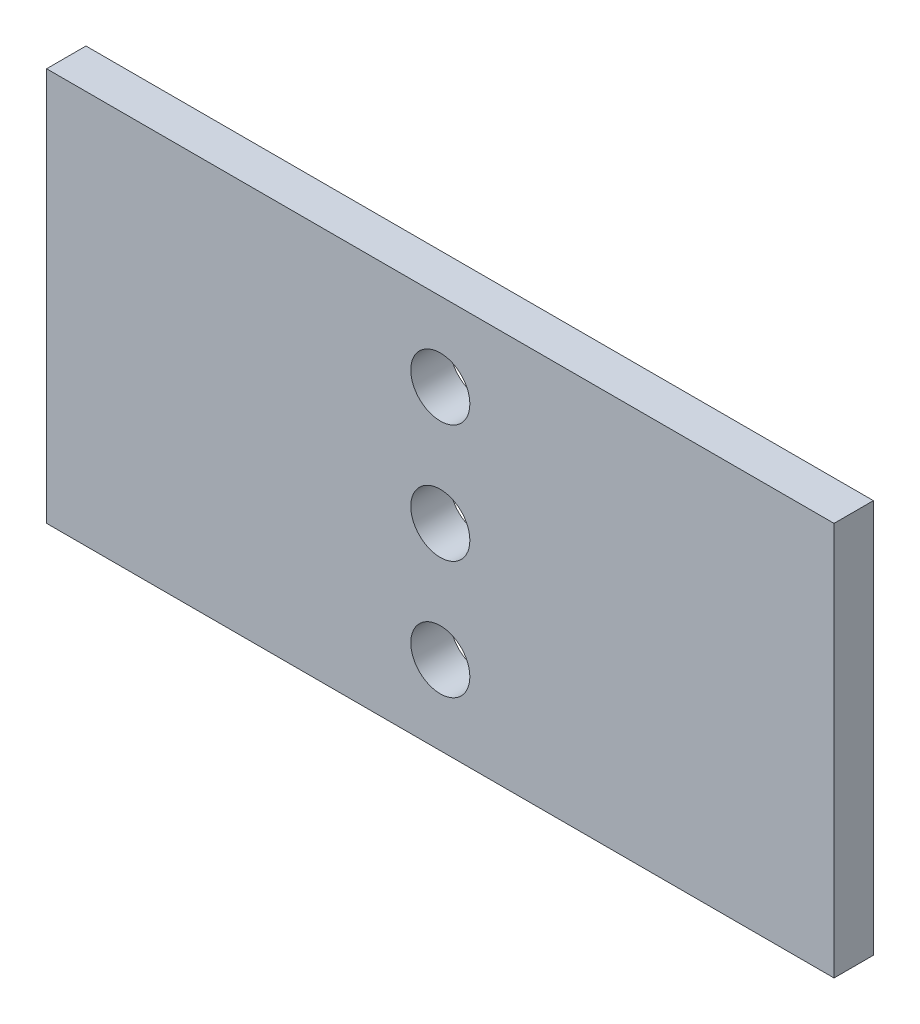
ISO-10303-21;
HEADER;
FILE_DESCRIPTION(('STEP AP214'),'2;1');
FILE_NAME('part.step','',(''),(''),'','','');
FILE_SCHEMA(('AUTOMOTIVE_DESIGN { 1 0 10303 214 1 1 1 1 }'));
ENDSEC;
DATA;
#1=APPLICATION_CONTEXT('core data for automotive mechanical design processes');
#2=APPLICATION_PROTOCOL_DEFINITION('international standard','automotive_design',2000,#1);
#3=PRODUCT_CONTEXT('',#1,'mechanical');
#4=PRODUCT('Part','Part','',(#3));
#5=PRODUCT_RELATED_PRODUCT_CATEGORY('part','',(#4));
#6=PRODUCT_DEFINITION_FORMATION('','',#4);
#7=PRODUCT_DEFINITION_CONTEXT('part definition',#1,'design');
#8=PRODUCT_DEFINITION('design','',#6,#7);
#9=PRODUCT_DEFINITION_SHAPE('','',#8);
#10=(LENGTH_UNIT() NAMED_UNIT(*) SI_UNIT(.MILLI.,.METRE.));
#11=(NAMED_UNIT(*) PLANE_ANGLE_UNIT() SI_UNIT($,.RADIAN.));
#12=(NAMED_UNIT(*) SI_UNIT($,.STERADIAN.) SOLID_ANGLE_UNIT());
#13=UNCERTAINTY_MEASURE_WITH_UNIT(LENGTH_MEASURE(1.E-05),#10,'distance_accuracy_value','');
#14=(GEOMETRIC_REPRESENTATION_CONTEXT(3) GLOBAL_UNCERTAINTY_ASSIGNED_CONTEXT((#13)) GLOBAL_UNIT_ASSIGNED_CONTEXT((#10,
#11,#12)) REPRESENTATION_CONTEXT('',''));
#15=CARTESIAN_POINT('',(0.,0.,0.));
#16=DIRECTION('',(0.,0.,1.));
#17=DIRECTION('',(1.,0.,0.));
#18=AXIS2_PLACEMENT_3D('',#15,#16,#17);
#19=CARTESIAN_POINT('',(0.,0.,10.));
#20=DIRECTION('',(0.,0.,-1.));
#21=DIRECTION('',(-1.,0.,0.));
#22=AXIS2_PLACEMENT_3D('',#19,#20,#21);
#23=PLANE('',#22);
#24=DIRECTION('',(0.,1.,0.));
#25=VECTOR('',#24,1.);
#26=CARTESIAN_POINT('',(99.9999999999999,-50.,10.));
#27=LINE('',#26,#25);
#28=CARTESIAN_POINT('',(99.9999999999999,-50.,10.));
#29=VERTEX_POINT('',#28);
#30=CARTESIAN_POINT('',(99.9999999999999,50.,10.));
#31=VERTEX_POINT('',#30);
#32=EDGE_CURVE('E95',#29,#31,#27,.T.);
#33=ORIENTED_EDGE('',*,*,#32,.T.);
#34=DIRECTION('',(-1.,0.,0.));
#35=VECTOR('',#34,1.);
#36=CARTESIAN_POINT('',(-100.,50.,10.));
#37=LINE('',#36,#35);
#38=CARTESIAN_POINT('',(-100.,50.,10.));
#39=VERTEX_POINT('',#38);
#40=EDGE_CURVE('E90',#31,#39,#37,.T.);
#41=ORIENTED_EDGE('',*,*,#40,.T.);
#42=DIRECTION('',(0.,-1.,0.));
#43=VECTOR('',#42,1.);
#44=CARTESIAN_POINT('',(-100.,-50.,10.));
#45=LINE('',#44,#43);
#46=CARTESIAN_POINT('',(-100.,-50.,10.));
#47=VERTEX_POINT('',#46);
#48=EDGE_CURVE('E93',#39,#47,#45,.T.);
#49=ORIENTED_EDGE('',*,*,#48,.T.);
#50=DIRECTION('',(1.,0.,0.));
#51=VECTOR('',#50,1.);
#52=CARTESIAN_POINT('',(-100.,-50.,10.));
#53=LINE('',#52,#51);
#54=EDGE_CURVE('E60',#47,#29,#53,.T.);
#55=ORIENTED_EDGE('',*,*,#54,.T.);
#56=EDGE_LOOP('',(#33,#41,#49,#55));
#57=FACE_BOUND('',#56,.T.);
#58=CARTESIAN_POINT('',(0.,0.,10.));
#59=DIRECTION('',(0.,0.,1.));
#60=DIRECTION('',(1.,0.,0.));
#61=AXIS2_PLACEMENT_3D('',#58,#59,#60);
#62=CIRCLE('',#61,7.5);
#63=CARTESIAN_POINT('',(7.5,0.,10.));
#64=VERTEX_POINT('',#63);
#65=EDGE_CURVE('E111',#64,#64,#62,.T.);
#66=ORIENTED_EDGE('',*,*,#65,.F.);
#67=EDGE_LOOP('',(#66));
#68=FACE_BOUND('',#67,.T.);
#69=CARTESIAN_POINT('',(0.,30.,10.));
#70=DIRECTION('',(0.,0.,1.));
#71=DIRECTION('',(1.,0.,0.));
#72=AXIS2_PLACEMENT_3D('',#69,#70,#71);
#73=CIRCLE('',#72,7.5);
#74=CARTESIAN_POINT('',(7.5,30.,10.));
#75=VERTEX_POINT('',#74);
#76=EDGE_CURVE('E126',#75,#75,#73,.T.);
#77=ORIENTED_EDGE('',*,*,#76,.F.);
#78=EDGE_LOOP('',(#77));
#79=FACE_BOUND('',#78,.T.);
#80=CARTESIAN_POINT('',(0.,-30.,10.));
#81=DIRECTION('',(0.,0.,1.));
#82=DIRECTION('',(1.,0.,0.));
#83=AXIS2_PLACEMENT_3D('',#80,#81,#82);
#84=CIRCLE('',#83,7.5);
#85=CARTESIAN_POINT('',(7.5,-30.,10.));
#86=VERTEX_POINT('',#85);
#87=EDGE_CURVE('E132',#86,#86,#84,.T.);
#88=ORIENTED_EDGE('',*,*,#87,.F.);
#89=EDGE_LOOP('',(#88));
#90=FACE_BOUND('',#89,.T.);
#91=ADVANCED_FACE('F43',(#57,#68,#79,#90),#23,.F.);
#92=CARTESIAN_POINT('',(0.,0.,0.));
#93=DIRECTION('',(0.,0.,-1.));
#94=DIRECTION('',(-1.,0.,0.));
#95=AXIS2_PLACEMENT_3D('',#92,#93,#94);
#96=PLANE('',#95);
#97=CARTESIAN_POINT('',(0.,30.,0.));
#98=DIRECTION('',(0.,0.,1.));
#99=DIRECTION('',(1.,0.,0.));
#100=AXIS2_PLACEMENT_3D('',#97,#98,#99);
#101=CIRCLE('',#100,7.5);
#102=CARTESIAN_POINT('',(7.5,30.,0.));
#103=VERTEX_POINT('',#102);
#104=EDGE_CURVE('E129',#103,#103,#101,.T.);
#105=ORIENTED_EDGE('',*,*,#104,.T.);
#106=EDGE_LOOP('',(#105));
#107=FACE_BOUND('',#106,.T.);
#108=DIRECTION('',(0.,1.,0.));
#109=VECTOR('',#108,1.);
#110=CARTESIAN_POINT('',(99.9999999999999,-50.,0.));
#111=LINE('',#110,#109);
#112=CARTESIAN_POINT('',(99.9999999999999,-50.,0.));
#113=VERTEX_POINT('',#112);
#114=CARTESIAN_POINT('',(99.9999999999999,50.,0.));
#115=VERTEX_POINT('',#114);
#116=EDGE_CURVE('E108',#113,#115,#111,.T.);
#117=ORIENTED_EDGE('',*,*,#116,.F.);
#118=DIRECTION('',(1.,0.,0.));
#119=VECTOR('',#118,1.);
#120=CARTESIAN_POINT('',(-100.,-50.,0.));
#121=LINE('',#120,#119);
#122=CARTESIAN_POINT('',(-100.,-50.,0.));
#123=VERTEX_POINT('',#122);
#124=EDGE_CURVE('E83',#123,#113,#121,.T.);
#125=ORIENTED_EDGE('',*,*,#124,.F.);
#126=DIRECTION('',(0.,-1.,0.));
#127=VECTOR('',#126,1.);
#128=CARTESIAN_POINT('',(-100.,-50.,0.));
#129=LINE('',#128,#127);
#130=CARTESIAN_POINT('',(-100.,50.,0.));
#131=VERTEX_POINT('',#130);
#132=EDGE_CURVE('E77',#131,#123,#129,.T.);
#133=ORIENTED_EDGE('',*,*,#132,.F.);
#134=DIRECTION('',(-1.,0.,0.));
#135=VECTOR('',#134,1.);
#136=CARTESIAN_POINT('',(-100.,50.,0.));
#137=LINE('',#136,#135);
#138=EDGE_CURVE('E99',#115,#131,#137,.T.);
#139=ORIENTED_EDGE('',*,*,#138,.F.);
#140=EDGE_LOOP('',(#117,#125,#133,#139));
#141=FACE_BOUND('',#140,.T.);
#142=CARTESIAN_POINT('',(0.,0.,0.));
#143=DIRECTION('',(0.,0.,1.));
#144=DIRECTION('',(1.,0.,0.));
#145=AXIS2_PLACEMENT_3D('',#142,#143,#144);
#146=CIRCLE('',#145,7.5);
#147=CARTESIAN_POINT('',(7.5,0.,0.));
#148=VERTEX_POINT('',#147);
#149=EDGE_CURVE('E123',#148,#148,#146,.T.);
#150=ORIENTED_EDGE('',*,*,#149,.T.);
#151=EDGE_LOOP('',(#150));
#152=FACE_BOUND('',#151,.T.);
#153=CARTESIAN_POINT('',(0.,-30.,0.));
#154=DIRECTION('',(0.,0.,1.));
#155=DIRECTION('',(1.,0.,0.));
#156=AXIS2_PLACEMENT_3D('',#153,#154,#155);
#157=CIRCLE('',#156,7.5);
#158=CARTESIAN_POINT('',(7.5,-30.,0.));
#159=VERTEX_POINT('',#158);
#160=EDGE_CURVE('E135',#159,#159,#157,.T.);
#161=ORIENTED_EDGE('',*,*,#160,.T.);
#162=EDGE_LOOP('',(#161));
#163=FACE_BOUND('',#162,.T.);
#164=ADVANCED_FACE('F119',(#107,#141,#152,#163),#96,.T.);
#165=CARTESIAN_POINT('',(99.9999999999999,-50.,10.));
#166=DIRECTION('',(-1.,0.,0.));
#167=DIRECTION('',(0.,0.,1.));
#168=AXIS2_PLACEMENT_3D('',#165,#166,#167);
#169=PLANE('',#168);
#170=ORIENTED_EDGE('',*,*,#116,.T.);
#171=DIRECTION('',(0.,0.,-1.));
#172=VECTOR('',#171,1.);
#173=CARTESIAN_POINT('',(99.9999999999999,50.,10.));
#174=LINE('',#173,#172);
#175=EDGE_CURVE('E12',#31,#115,#174,.T.);
#176=ORIENTED_EDGE('',*,*,#175,.F.);
#177=ORIENTED_EDGE('',*,*,#32,.F.);
#178=DIRECTION('',(0.,0.,-1.));
#179=VECTOR('',#178,1.);
#180=CARTESIAN_POINT('',(99.9999999999999,-50.,10.));
#181=LINE('',#180,#179);
#182=EDGE_CURVE('E103',#29,#113,#181,.T.);
#183=ORIENTED_EDGE('',*,*,#182,.T.);
#184=EDGE_LOOP('',(#170,#176,#177,#183));
#185=FACE_BOUND('',#184,.T.);
#186=ADVANCED_FACE('F45',(#185),#169,.F.);
#187=CARTESIAN_POINT('',(-100.,50.,10.));
#188=DIRECTION('',(0.,-1.,0.));
#189=DIRECTION('',(0.,0.,-1.));
#190=AXIS2_PLACEMENT_3D('',#187,#188,#189);
#191=PLANE('',#190);
#192=ORIENTED_EDGE('',*,*,#138,.T.);
#193=DIRECTION('',(0.,0.,-1.));
#194=VECTOR('',#193,1.);
#195=CARTESIAN_POINT('',(-100.,50.,10.));
#196=LINE('',#195,#194);
#197=EDGE_CURVE('E52',#39,#131,#196,.T.);
#198=ORIENTED_EDGE('',*,*,#197,.F.);
#199=ORIENTED_EDGE('',*,*,#40,.F.);
#200=ORIENTED_EDGE('',*,*,#175,.T.);
#201=EDGE_LOOP('',(#192,#198,#199,#200));
#202=FACE_BOUND('',#201,.T.);
#203=ADVANCED_FACE('F98',(#202),#191,.F.);
#204=CARTESIAN_POINT('',(-100.,-50.,10.));
#205=DIRECTION('',(1.,0.,0.));
#206=DIRECTION('',(0.,0.,-1.));
#207=AXIS2_PLACEMENT_3D('',#204,#205,#206);
#208=PLANE('',#207);
#209=ORIENTED_EDGE('',*,*,#132,.T.);
#210=DIRECTION('',(0.,0.,-1.));
#211=VECTOR('',#210,1.);
#212=CARTESIAN_POINT('',(-100.,-50.,10.));
#213=LINE('',#212,#211);
#214=EDGE_CURVE('E100',#47,#123,#213,.T.);
#215=ORIENTED_EDGE('',*,*,#214,.F.);
#216=ORIENTED_EDGE('',*,*,#48,.F.);
#217=ORIENTED_EDGE('',*,*,#197,.T.);
#218=EDGE_LOOP('',(#209,#215,#216,#217));
#219=FACE_BOUND('',#218,.T.);
#220=ADVANCED_FACE('F101',(#219),#208,.F.);
#221=CARTESIAN_POINT('',(-100.,-50.,10.));
#222=DIRECTION('',(0.,1.,0.));
#223=DIRECTION('',(0.,0.,1.));
#224=AXIS2_PLACEMENT_3D('',#221,#222,#223);
#225=PLANE('',#224);
#226=ORIENTED_EDGE('',*,*,#124,.T.);
#227=ORIENTED_EDGE('',*,*,#182,.F.);
#228=ORIENTED_EDGE('',*,*,#54,.F.);
#229=ORIENTED_EDGE('',*,*,#214,.T.);
#230=EDGE_LOOP('',(#226,#227,#228,#229));
#231=FACE_BOUND('',#230,.T.);
#232=ADVANCED_FACE('F116',(#231),#225,.F.);
#233=CARTESIAN_POINT('',(0.,0.,10.));
#234=DIRECTION('',(0.,0.,-1.));
#235=DIRECTION('',(-1.,0.,0.));
#236=AXIS2_PLACEMENT_3D('',#233,#234,#235);
#237=CYLINDRICAL_SURFACE('',#236,7.5);
#238=ORIENTED_EDGE('',*,*,#65,.T.);
#239=EDGE_LOOP('',(#238));
#240=FACE_BOUND('',#239,.T.);
#241=ORIENTED_EDGE('',*,*,#149,.F.);
#242=EDGE_LOOP('',(#241));
#243=FACE_BOUND('',#242,.T.);
#244=ADVANCED_FACE('F152',(#240,#243),#237,.F.);
#245=CARTESIAN_POINT('',(0.,30.,10.));
#246=DIRECTION('',(0.,0.,-1.));
#247=DIRECTION('',(-1.,0.,0.));
#248=AXIS2_PLACEMENT_3D('',#245,#246,#247);
#249=CYLINDRICAL_SURFACE('',#248,7.5);
#250=ORIENTED_EDGE('',*,*,#76,.T.);
#251=EDGE_LOOP('',(#250));
#252=FACE_BOUND('',#251,.T.);
#253=ORIENTED_EDGE('',*,*,#104,.F.);
#254=EDGE_LOOP('',(#253));
#255=FACE_BOUND('',#254,.T.);
#256=ADVANCED_FACE('F198',(#252,#255),#249,.F.);
#257=CARTESIAN_POINT('',(0.,-30.,10.));
#258=DIRECTION('',(0.,0.,-1.));
#259=DIRECTION('',(-1.,0.,0.));
#260=AXIS2_PLACEMENT_3D('',#257,#258,#259);
#261=CYLINDRICAL_SURFACE('',#260,7.5);
#262=ORIENTED_EDGE('',*,*,#87,.T.);
#263=EDGE_LOOP('',(#262));
#264=FACE_BOUND('',#263,.T.);
#265=ORIENTED_EDGE('',*,*,#160,.F.);
#266=EDGE_LOOP('',(#265));
#267=FACE_BOUND('',#266,.T.);
#268=ADVANCED_FACE('F141',(#264,#267),#261,.F.);
#269=CLOSED_SHELL('',(#91,#164,#186,#203,#220,#232,#244,#256,#268));
#270=MANIFOLD_SOLID_BREP('B2',#269);
#271=ADVANCED_BREP_SHAPE_REPRESENTATION('',(#18,#270),#14);
#272=SHAPE_DEFINITION_REPRESENTATION(#9,#271);
ENDSEC;
END-ISO-10303-21;
